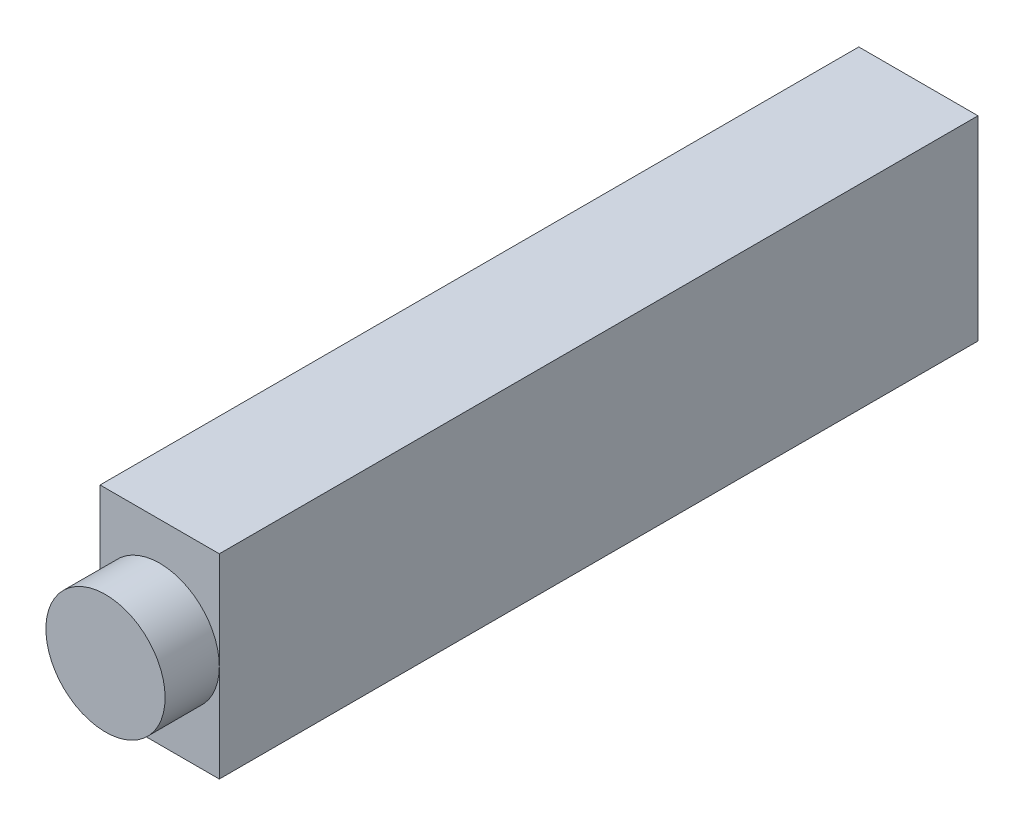
ISO-10303-21;
HEADER;
FILE_DESCRIPTION(('STEP AP214'),'2;1');
FILE_NAME('part.step','',(''),(''),'','','');
FILE_SCHEMA(('AUTOMOTIVE_DESIGN { 1 0 10303 214 1 1 1 1 }'));
ENDSEC;
DATA;
#1=APPLICATION_CONTEXT('core data for automotive mechanical design processes');
#2=APPLICATION_PROTOCOL_DEFINITION('international standard','automotive_design',2000,#1);
#3=PRODUCT_CONTEXT('',#1,'mechanical');
#4=PRODUCT('Part','Part','',(#3));
#5=PRODUCT_RELATED_PRODUCT_CATEGORY('part','',(#4));
#6=PRODUCT_DEFINITION_FORMATION('','',#4);
#7=PRODUCT_DEFINITION_CONTEXT('part definition',#1,'design');
#8=PRODUCT_DEFINITION('design','',#6,#7);
#9=PRODUCT_DEFINITION_SHAPE('','',#8);
#10=(LENGTH_UNIT() NAMED_UNIT(*) SI_UNIT(.MILLI.,.METRE.));
#11=(NAMED_UNIT(*) PLANE_ANGLE_UNIT() SI_UNIT($,.RADIAN.));
#12=(NAMED_UNIT(*) SI_UNIT($,.STERADIAN.) SOLID_ANGLE_UNIT());
#13=UNCERTAINTY_MEASURE_WITH_UNIT(LENGTH_MEASURE(1.E-05),#10,'distance_accuracy_value','');
#14=(GEOMETRIC_REPRESENTATION_CONTEXT(3) GLOBAL_UNCERTAINTY_ASSIGNED_CONTEXT((#13)) GLOBAL_UNIT_ASSIGNED_CONTEXT((#10,
#11,#12)) REPRESENTATION_CONTEXT('',''));
#15=CARTESIAN_POINT('',(0.,0.,0.));
#16=DIRECTION('',(0.,0.,1.));
#17=DIRECTION('',(1.,0.,0.));
#18=AXIS2_PLACEMENT_3D('',#15,#16,#17);
#19=CARTESIAN_POINT('',(0.,0.,10.));
#20=DIRECTION('',(0.,0.,-1.));
#21=DIRECTION('',(-1.,0.,0.));
#22=AXIS2_PLACEMENT_3D('',#19,#20,#21);
#23=CYLINDRICAL_SURFACE('',#22,11.);
#24=CARTESIAN_POINT('',(0.,0.,10.));
#25=DIRECTION('',(0.,0.,1.));
#26=DIRECTION('',(1.,0.,0.));
#27=AXIS2_PLACEMENT_3D('',#24,#25,#26);
#28=CIRCLE('',#27,11.);
#29=CARTESIAN_POINT('',(11.,0.,10.));
#30=VERTEX_POINT('',#29);
#31=EDGE_CURVE('E12',#30,#30,#28,.T.);
#32=ORIENTED_EDGE('',*,*,#31,.F.);
#33=EDGE_LOOP('',(#32));
#34=FACE_BOUND('',#33,.T.);
#35=CARTESIAN_POINT('',(0.,0.,0.));
#36=DIRECTION('',(0.,0.,1.));
#37=DIRECTION('',(1.,0.,0.));
#38=AXIS2_PLACEMENT_3D('',#35,#36,#37);
#39=CIRCLE('',#38,11.);
#40=CARTESIAN_POINT('',(11.,0.,0.));
#41=VERTEX_POINT('',#40);
#42=CARTESIAN_POINT('',(-11.,0.,0.));
#43=VERTEX_POINT('',#42);
#44=EDGE_CURVE('E53',#41,#43,#39,.T.);
#45=ORIENTED_EDGE('',*,*,#44,.T.);
#46=EDGE_CURVE('E72',#43,#41,#39,.T.);
#47=ORIENTED_EDGE('',*,*,#46,.T.);
#48=EDGE_LOOP('',(#45,#47));
#49=FACE_BOUND('',#48,.T.);
#50=ADVANCED_FACE('F50',(#34,#49),#23,.T.);
#51=CARTESIAN_POINT('',(0.,0.,10.));
#52=DIRECTION('',(0.,0.,1.));
#53=DIRECTION('',(1.,0.,0.));
#54=AXIS2_PLACEMENT_3D('',#51,#52,#53);
#55=PLANE('',#54);
#56=ORIENTED_EDGE('',*,*,#31,.T.);
#57=EDGE_LOOP('',(#56));
#58=FACE_BOUND('',#57,.T.);
#59=ADVANCED_FACE('F172',(#58),#55,.T.);
#60=CARTESIAN_POINT('',(0.,0.,0.));
#61=DIRECTION('',(0.,0.,1.));
#62=DIRECTION('',(1.,0.,0.));
#63=AXIS2_PLACEMENT_3D('',#60,#61,#62);
#64=PLANE('',#63);
#65=ORIENTED_EDGE('',*,*,#44,.F.);
#66=DIRECTION('',(0.,-1.,0.));
#67=VECTOR('',#66,1.);
#68=CARTESIAN_POINT('',(11.,18.,0.));
#69=LINE('',#68,#67);
#70=CARTESIAN_POINT('',(11.,18.,0.));
#71=VERTEX_POINT('',#70);
#72=EDGE_CURVE('E65',#71,#41,#69,.T.);
#73=ORIENTED_EDGE('',*,*,#72,.F.);
#74=DIRECTION('',(1.,0.,0.));
#75=VECTOR('',#74,1.);
#76=CARTESIAN_POINT('',(-11.,18.,0.));
#77=LINE('',#76,#75);
#78=CARTESIAN_POINT('',(-11.,18.,0.));
#79=VERTEX_POINT('',#78);
#80=EDGE_CURVE('E118',#79,#71,#77,.T.);
#81=ORIENTED_EDGE('',*,*,#80,.F.);
#82=DIRECTION('',(0.,1.,0.));
#83=VECTOR('',#82,1.);
#84=CARTESIAN_POINT('',(-11.,18.,0.));
#85=LINE('',#84,#83);
#86=EDGE_CURVE('E150',#43,#79,#85,.T.);
#87=ORIENTED_EDGE('',*,*,#86,.F.);
#88=EDGE_LOOP('',(#65,#73,#81,#87));
#89=FACE_BOUND('',#88,.T.);
#90=ADVANCED_FACE('F167',(#89),#64,.T.);
#91=ORIENTED_EDGE('',*,*,#46,.F.);
#92=CARTESIAN_POINT('',(-11.,-18.,0.));
#93=VERTEX_POINT('',#92);
#94=EDGE_CURVE('E151',#93,#43,#85,.T.);
#95=ORIENTED_EDGE('',*,*,#94,.F.);
#96=DIRECTION('',(-1.,0.,0.));
#97=VECTOR('',#96,1.);
#98=CARTESIAN_POINT('',(-11.,-18.,0.));
#99=LINE('',#98,#97);
#100=CARTESIAN_POINT('',(11.,-18.,0.));
#101=VERTEX_POINT('',#100);
#102=EDGE_CURVE('E147',#101,#93,#99,.T.);
#103=ORIENTED_EDGE('',*,*,#102,.F.);
#104=EDGE_CURVE('E120',#41,#101,#69,.T.);
#105=ORIENTED_EDGE('',*,*,#104,.F.);
#106=EDGE_LOOP('',(#91,#95,#103,#105));
#107=FACE_BOUND('',#106,.T.);
#108=ADVANCED_FACE('F182',(#107),#64,.T.);
#109=CARTESIAN_POINT('',(11.,18.,-140.));
#110=DIRECTION('',(-1.,0.,0.));
#111=DIRECTION('',(0.,-1.,0.));
#112=AXIS2_PLACEMENT_3D('',#109,#110,#111);
#113=PLANE('',#112);
#114=ORIENTED_EDGE('',*,*,#72,.T.);
#115=ORIENTED_EDGE('',*,*,#104,.T.);
#116=DIRECTION('',(0.,0.,1.));
#117=VECTOR('',#116,1.);
#118=CARTESIAN_POINT('',(11.,-18.,-140.));
#119=LINE('',#118,#117);
#120=CARTESIAN_POINT('',(11.,-18.,-140.));
#121=VERTEX_POINT('',#120);
#122=EDGE_CURVE('E103',#121,#101,#119,.T.);
#123=ORIENTED_EDGE('',*,*,#122,.F.);
#124=DIRECTION('',(0.,-1.,0.));
#125=VECTOR('',#124,1.);
#126=CARTESIAN_POINT('',(11.,18.,-140.));
#127=LINE('',#126,#125);
#128=CARTESIAN_POINT('',(11.,18.,-140.));
#129=VERTEX_POINT('',#128);
#130=EDGE_CURVE('E110',#129,#121,#127,.T.);
#131=ORIENTED_EDGE('',*,*,#130,.F.);
#132=DIRECTION('',(0.,0.,1.));
#133=VECTOR('',#132,1.);
#134=CARTESIAN_POINT('',(11.,18.,-140.));
#135=LINE('',#134,#133);
#136=EDGE_CURVE('E144',#129,#71,#135,.T.);
#137=ORIENTED_EDGE('',*,*,#136,.T.);
#138=EDGE_LOOP('',(#114,#115,#123,#131,#137));
#139=FACE_BOUND('',#138,.T.);
#140=ADVANCED_FACE('F119',(#139),#113,.F.);
#141=CARTESIAN_POINT('',(-11.,-18.,-140.));
#142=DIRECTION('',(0.,1.,0.));
#143=DIRECTION('',(0.,0.,1.));
#144=AXIS2_PLACEMENT_3D('',#141,#142,#143);
#145=PLANE('',#144);
#146=ORIENTED_EDGE('',*,*,#102,.T.);
#147=DIRECTION('',(0.,0.,1.));
#148=VECTOR('',#147,1.);
#149=CARTESIAN_POINT('',(-11.,-18.,-140.));
#150=LINE('',#149,#148);
#151=CARTESIAN_POINT('',(-11.,-18.,-140.));
#152=VERTEX_POINT('',#151);
#153=EDGE_CURVE('E105',#152,#93,#150,.T.);
#154=ORIENTED_EDGE('',*,*,#153,.F.);
#155=DIRECTION('',(-1.,0.,0.));
#156=VECTOR('',#155,1.);
#157=CARTESIAN_POINT('',(-11.,-18.,-140.));
#158=LINE('',#157,#156);
#159=EDGE_CURVE('E99',#121,#152,#158,.T.);
#160=ORIENTED_EDGE('',*,*,#159,.F.);
#161=ORIENTED_EDGE('',*,*,#122,.T.);
#162=EDGE_LOOP('',(#146,#154,#160,#161));
#163=FACE_BOUND('',#162,.T.);
#164=ADVANCED_FACE('F101',(#163),#145,.F.);
#165=CARTESIAN_POINT('',(-11.,18.,-140.));
#166=DIRECTION('',(1.,0.,0.));
#167=DIRECTION('',(0.,1.,0.));
#168=AXIS2_PLACEMENT_3D('',#165,#166,#167);
#169=PLANE('',#168);
#170=ORIENTED_EDGE('',*,*,#94,.T.);
#171=ORIENTED_EDGE('',*,*,#86,.T.);
#172=DIRECTION('',(0.,0.,1.));
#173=VECTOR('',#172,1.);
#174=CARTESIAN_POINT('',(-11.,18.,-140.));
#175=LINE('',#174,#173);
#176=CARTESIAN_POINT('',(-11.,18.,-140.));
#177=VERTEX_POINT('',#176);
#178=EDGE_CURVE('E126',#177,#79,#175,.T.);
#179=ORIENTED_EDGE('',*,*,#178,.F.);
#180=DIRECTION('',(0.,1.,0.));
#181=VECTOR('',#180,1.);
#182=CARTESIAN_POINT('',(-11.,18.,-140.));
#183=LINE('',#182,#181);
#184=EDGE_CURVE('E109',#152,#177,#183,.T.);
#185=ORIENTED_EDGE('',*,*,#184,.F.);
#186=ORIENTED_EDGE('',*,*,#153,.T.);
#187=EDGE_LOOP('',(#170,#171,#179,#185,#186));
#188=FACE_BOUND('',#187,.T.);
#189=ADVANCED_FACE('F189',(#188),#169,.F.);
#190=CARTESIAN_POINT('',(-11.,18.,-140.));
#191=DIRECTION('',(0.,-1.,0.));
#192=DIRECTION('',(1.,0.,0.));
#193=AXIS2_PLACEMENT_3D('',#190,#191,#192);
#194=PLANE('',#193);
#195=ORIENTED_EDGE('',*,*,#80,.T.);
#196=ORIENTED_EDGE('',*,*,#136,.F.);
#197=DIRECTION('',(1.,0.,0.));
#198=VECTOR('',#197,1.);
#199=CARTESIAN_POINT('',(-11.,18.,-140.));
#200=LINE('',#199,#198);
#201=EDGE_CURVE('E115',#177,#129,#200,.T.);
#202=ORIENTED_EDGE('',*,*,#201,.F.);
#203=ORIENTED_EDGE('',*,*,#178,.T.);
#204=EDGE_LOOP('',(#195,#196,#202,#203));
#205=FACE_BOUND('',#204,.T.);
#206=ADVANCED_FACE('F163',(#205),#194,.F.);
#207=CARTESIAN_POINT('',(0.,0.,-140.));
#208=DIRECTION('',(0.,0.,1.));
#209=DIRECTION('',(1.,0.,0.));
#210=AXIS2_PLACEMENT_3D('',#207,#208,#209);
#211=PLANE('',#210);
#212=ORIENTED_EDGE('',*,*,#130,.T.);
#213=ORIENTED_EDGE('',*,*,#159,.T.);
#214=ORIENTED_EDGE('',*,*,#184,.T.);
#215=ORIENTED_EDGE('',*,*,#201,.T.);
#216=EDGE_LOOP('',(#212,#213,#214,#215));
#217=FACE_BOUND('',#216,.T.);
#218=ADVANCED_FACE('F113',(#217),#211,.F.);
#219=CLOSED_SHELL('',(#50,#59,#90,#108,#140,#164,#189,#206,#218));
#220=MANIFOLD_SOLID_BREP('B2',#219);
#221=ADVANCED_BREP_SHAPE_REPRESENTATION('',(#18,#220),#14);
#222=SHAPE_DEFINITION_REPRESENTATION(#9,#221);
ENDSEC;
END-ISO-10303-21;
